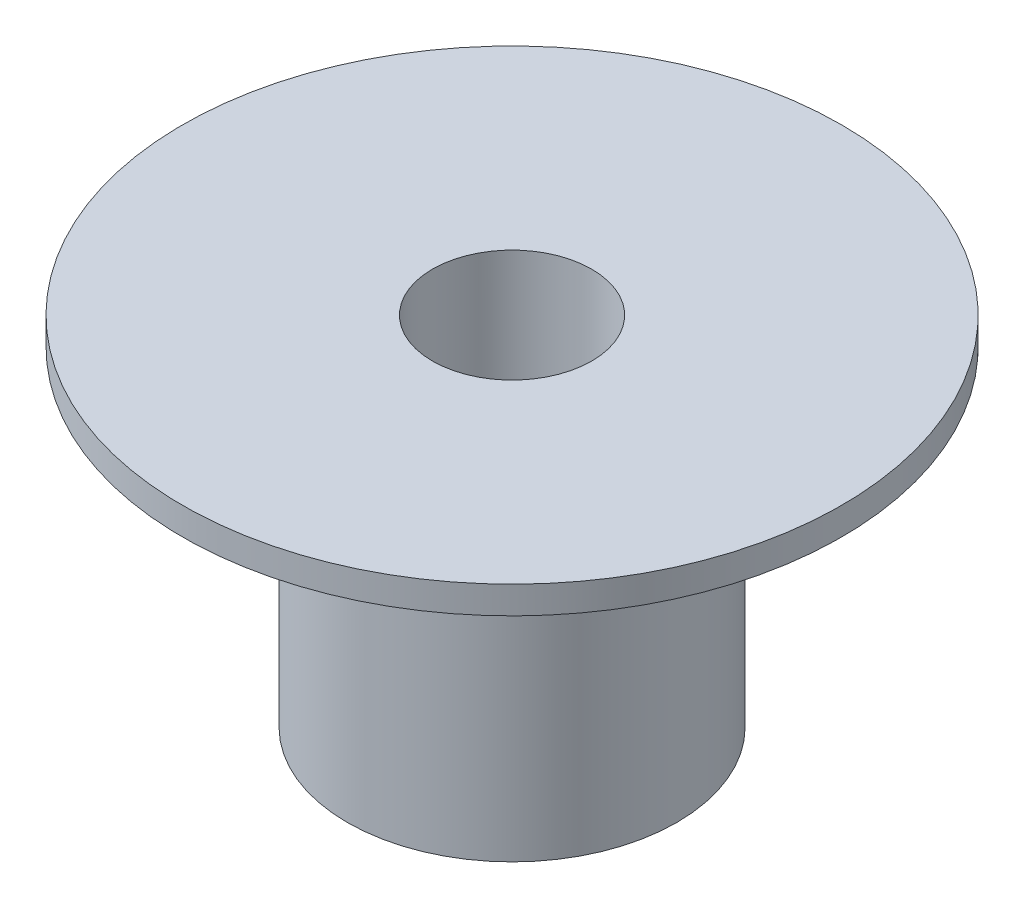
ISO-10303-21;
HEADER;
FILE_DESCRIPTION(('STEP AP214'),'2;1');
FILE_NAME('part.step','',(''),(''),'','','');
FILE_SCHEMA(('AUTOMOTIVE_DESIGN { 1 0 10303 214 1 1 1 1 }'));
ENDSEC;
DATA;
#1=APPLICATION_CONTEXT('core data for automotive mechanical design processes');
#2=APPLICATION_PROTOCOL_DEFINITION('international standard','automotive_design',2000,#1);
#3=PRODUCT_CONTEXT('',#1,'mechanical');
#4=PRODUCT('Part','Part','',(#3));
#5=PRODUCT_RELATED_PRODUCT_CATEGORY('part','',(#4));
#6=PRODUCT_DEFINITION_FORMATION('','',#4);
#7=PRODUCT_DEFINITION_CONTEXT('part definition',#1,'design');
#8=PRODUCT_DEFINITION('design','',#6,#7);
#9=PRODUCT_DEFINITION_SHAPE('','',#8);
#10=(LENGTH_UNIT() NAMED_UNIT(*) SI_UNIT(.MILLI.,.METRE.));
#11=(NAMED_UNIT(*) PLANE_ANGLE_UNIT() SI_UNIT($,.RADIAN.));
#12=(NAMED_UNIT(*) SI_UNIT($,.STERADIAN.) SOLID_ANGLE_UNIT());
#13=UNCERTAINTY_MEASURE_WITH_UNIT(LENGTH_MEASURE(1.E-05),#10,'distance_accuracy_value','');
#14=(GEOMETRIC_REPRESENTATION_CONTEXT(3) GLOBAL_UNCERTAINTY_ASSIGNED_CONTEXT((#13)) GLOBAL_UNIT_ASSIGNED_CONTEXT((#10,
#11,#12)) REPRESENTATION_CONTEXT('',''));
#15=CARTESIAN_POINT('',(0.,0.,0.));
#16=DIRECTION('',(0.,0.,1.));
#17=DIRECTION('',(1.,0.,0.));
#18=AXIS2_PLACEMENT_3D('',#15,#16,#17);
#19=CARTESIAN_POINT('',(0.,0.,0.));
#20=DIRECTION('',(0.,1.,0.));
#21=DIRECTION('',(0.,0.,1.));
#22=AXIS2_PLACEMENT_3D('',#19,#20,#21);
#23=PLANE('',#22);
#24=CARTESIAN_POINT('',(0.,0.,0.));
#25=DIRECTION('',(0.,1.,0.));
#26=DIRECTION('',(0.,0.,1.));
#27=AXIS2_PLACEMENT_3D('',#24,#25,#26);
#28=CIRCLE('',#27,1.44999999999999);
#29=CARTESIAN_POINT('',(0.,0.,1.44999999999999));
#30=VERTEX_POINT('',#29);
#31=EDGE_CURVE('E51',#30,#30,#28,.T.);
#32=ORIENTED_EDGE('',*,*,#31,.F.);
#33=EDGE_LOOP('',(#32));
#34=FACE_BOUND('',#33,.T.);
#35=CARTESIAN_POINT('',(0.,0.,0.));
#36=DIRECTION('',(0.,-1.,0.));
#37=DIRECTION('',(0.,0.,-1.));
#38=AXIS2_PLACEMENT_3D('',#35,#36,#37);
#39=CIRCLE('',#38,6.);
#40=CARTESIAN_POINT('',(0.,0.,-6.));
#41=VERTEX_POINT('',#40);
#42=EDGE_CURVE('E10',#41,#41,#39,.T.);
#43=ORIENTED_EDGE('',*,*,#42,.F.);
#44=EDGE_LOOP('',(#43));
#45=FACE_BOUND('',#44,.T.);
#46=ADVANCED_FACE('F32',(#34,#45),#23,.T.);
#47=CARTESIAN_POINT('',(0.,-6.5,0.));
#48=DIRECTION('',(0.,-1.,0.));
#49=DIRECTION('',(0.,0.,-1.));
#50=AXIS2_PLACEMENT_3D('',#47,#48,#49);
#51=CYLINDRICAL_SURFACE('',#50,6.);
#52=ORIENTED_EDGE('',*,*,#42,.T.);
#53=EDGE_LOOP('',(#52));
#54=FACE_BOUND('',#53,.T.);
#55=CARTESIAN_POINT('',(0.,-0.5,0.));
#56=DIRECTION('',(0.,-1.,0.));
#57=DIRECTION('',(0.,0.,-1.));
#58=AXIS2_PLACEMENT_3D('',#55,#56,#57);
#59=CIRCLE('',#58,6.);
#60=CARTESIAN_POINT('',(0.,-0.5,-6.));
#61=VERTEX_POINT('',#60);
#62=EDGE_CURVE('E38',#61,#61,#59,.T.);
#63=ORIENTED_EDGE('',*,*,#62,.F.);
#64=EDGE_LOOP('',(#63));
#65=FACE_BOUND('',#64,.T.);
#66=ADVANCED_FACE('F75',(#54,#65),#51,.T.);
#67=CARTESIAN_POINT('',(0.,-0.5,-6.));
#68=DIRECTION('',(0.,-1.,0.));
#69=DIRECTION('',(0.,0.,-1.));
#70=AXIS2_PLACEMENT_3D('',#67,#68,#69);
#71=PLANE('',#70);
#72=ORIENTED_EDGE('',*,*,#62,.T.);
#73=EDGE_LOOP('',(#72));
#74=FACE_BOUND('',#73,.T.);
#75=CARTESIAN_POINT('',(0.,-0.5,0.));
#76=DIRECTION('',(0.,-1.,0.));
#77=DIRECTION('',(0.,0.,-1.));
#78=AXIS2_PLACEMENT_3D('',#75,#76,#77);
#79=CIRCLE('',#78,3.);
#80=CARTESIAN_POINT('',(0.,-0.5,-3.));
#81=VERTEX_POINT('',#80);
#82=EDGE_CURVE('E42',#81,#81,#79,.T.);
#83=ORIENTED_EDGE('',*,*,#82,.F.);
#84=EDGE_LOOP('',(#83));
#85=FACE_BOUND('',#84,.T.);
#86=ADVANCED_FACE('F69',(#74,#85),#71,.T.);
#87=CARTESIAN_POINT('',(0.,-6.5,0.));
#88=DIRECTION('',(0.,-1.,0.));
#89=DIRECTION('',(0.,0.,-1.));
#90=AXIS2_PLACEMENT_3D('',#87,#88,#89);
#91=CYLINDRICAL_SURFACE('',#90,3.);
#92=ORIENTED_EDGE('',*,*,#82,.T.);
#93=EDGE_LOOP('',(#92));
#94=FACE_BOUND('',#93,.T.);
#95=CARTESIAN_POINT('',(0.,-6.5,0.));
#96=DIRECTION('',(0.,-1.,0.));
#97=DIRECTION('',(0.,0.,-1.));
#98=AXIS2_PLACEMENT_3D('',#95,#96,#97);
#99=CIRCLE('',#98,3.);
#100=CARTESIAN_POINT('',(0.,-6.5,-3.));
#101=VERTEX_POINT('',#100);
#102=EDGE_CURVE('E46',#101,#101,#99,.T.);
#103=ORIENTED_EDGE('',*,*,#102,.F.);
#104=EDGE_LOOP('',(#103));
#105=FACE_BOUND('',#104,.T.);
#106=ADVANCED_FACE('F64',(#94,#105),#91,.T.);
#107=CARTESIAN_POINT('',(0.,-6.5,-3.));
#108=DIRECTION('',(0.,-1.,0.));
#109=DIRECTION('',(0.,0.,-1.));
#110=AXIS2_PLACEMENT_3D('',#107,#108,#109);
#111=PLANE('',#110);
#112=CARTESIAN_POINT('',(0.,-6.5,0.));
#113=DIRECTION('',(0.,-1.,0.));
#114=DIRECTION('',(0.,0.,-1.));
#115=AXIS2_PLACEMENT_3D('',#112,#113,#114);
#116=CIRCLE('',#115,1.44999999999999);
#117=CARTESIAN_POINT('',(0.,-6.5,-1.44999999999999));
#118=VERTEX_POINT('',#117);
#119=EDGE_CURVE('E54',#118,#118,#116,.T.);
#120=ORIENTED_EDGE('',*,*,#119,.F.);
#121=EDGE_LOOP('',(#120));
#122=FACE_BOUND('',#121,.T.);
#123=ORIENTED_EDGE('',*,*,#102,.T.);
#124=EDGE_LOOP('',(#123));
#125=FACE_BOUND('',#124,.T.);
#126=ADVANCED_FACE('F61',(#122,#125),#111,.T.);
#127=CARTESIAN_POINT('',(0.,-6.5,0.));
#128=DIRECTION('',(0.,-1.,0.));
#129=DIRECTION('',(0.,0.,-1.));
#130=AXIS2_PLACEMENT_3D('',#127,#128,#129);
#131=CYLINDRICAL_SURFACE('',#130,1.44999999999999);
#132=ORIENTED_EDGE('',*,*,#119,.T.);
#133=EDGE_LOOP('',(#132));
#134=FACE_BOUND('',#133,.T.);
#135=ORIENTED_EDGE('',*,*,#31,.T.);
#136=EDGE_LOOP('',(#135));
#137=FACE_BOUND('',#136,.T.);
#138=ADVANCED_FACE('F58',(#134,#137),#131,.F.);
#139=CLOSED_SHELL('',(#46,#66,#86,#106,#126,#138));
#140=MANIFOLD_SOLID_BREP('B2',#139);
#141=ADVANCED_BREP_SHAPE_REPRESENTATION('',(#18,#140),#14);
#142=SHAPE_DEFINITION_REPRESENTATION(#9,#141);
ENDSEC;
END-ISO-10303-21;
